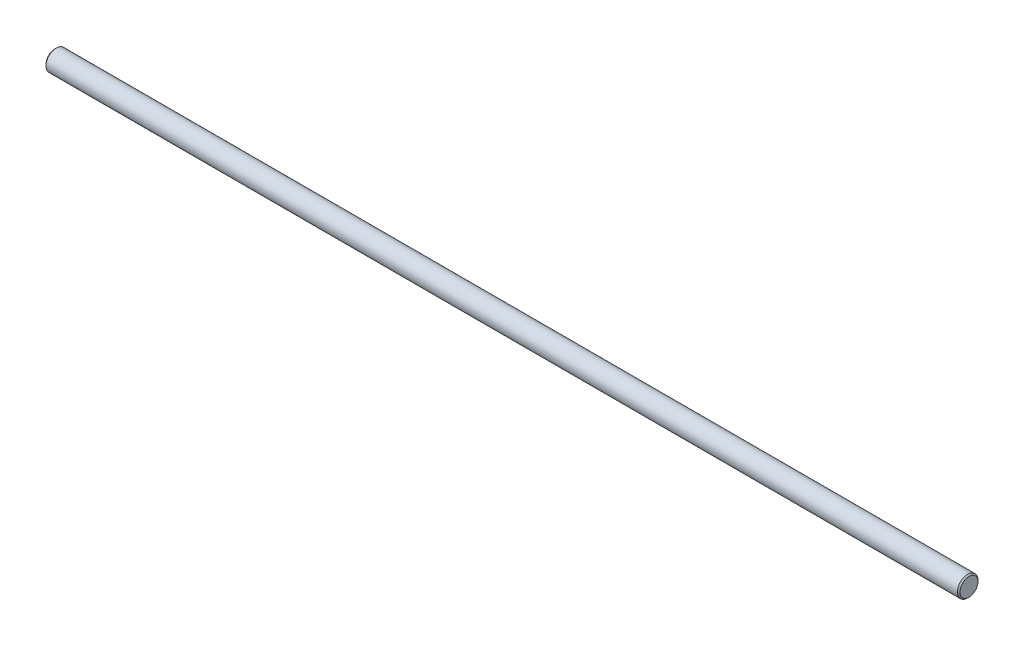
ISO-10303-21;
HEADER;
FILE_DESCRIPTION(('STEP AP214'),'2;1');
FILE_NAME('part.step','',(''),(''),'','','');
FILE_SCHEMA(('AUTOMOTIVE_DESIGN { 1 0 10303 214 1 1 1 1 }'));
ENDSEC;
DATA;
#1=APPLICATION_CONTEXT('core data for automotive mechanical design processes');
#2=APPLICATION_PROTOCOL_DEFINITION('international standard','automotive_design',2000,#1);
#3=PRODUCT_CONTEXT('',#1,'mechanical');
#4=PRODUCT('Part','Part','',(#3));
#5=PRODUCT_RELATED_PRODUCT_CATEGORY('part','',(#4));
#6=PRODUCT_DEFINITION_FORMATION('','',#4);
#7=PRODUCT_DEFINITION_CONTEXT('part definition',#1,'design');
#8=PRODUCT_DEFINITION('design','',#6,#7);
#9=PRODUCT_DEFINITION_SHAPE('','',#8);
#10=(LENGTH_UNIT() NAMED_UNIT(*) SI_UNIT(.MILLI.,.METRE.));
#11=(NAMED_UNIT(*) PLANE_ANGLE_UNIT() SI_UNIT($,.RADIAN.));
#12=(NAMED_UNIT(*) SI_UNIT($,.STERADIAN.) SOLID_ANGLE_UNIT());
#13=UNCERTAINTY_MEASURE_WITH_UNIT(LENGTH_MEASURE(1.E-05),#10,'distance_accuracy_value','');
#14=(GEOMETRIC_REPRESENTATION_CONTEXT(3) GLOBAL_UNCERTAINTY_ASSIGNED_CONTEXT((#13)) GLOBAL_UNIT_ASSIGNED_CONTEXT((#10,
#11,#12)) REPRESENTATION_CONTEXT('',''));
#15=CARTESIAN_POINT('',(0.,0.,0.));
#16=DIRECTION('',(0.,0.,1.));
#17=DIRECTION('',(1.,0.,0.));
#18=AXIS2_PLACEMENT_3D('',#15,#16,#17);
#19=CARTESIAN_POINT('',(0.50000000001296,0.,0.));
#20=DIRECTION('',(1.,0.,0.));
#21=DIRECTION('',(0.,0.,-1.));
#22=AXIS2_PLACEMENT_3D('',#19,#20,#21);
#23=CONICAL_SURFACE('',#22,3.99999999998704,0.785398163397449);
#24=CARTESIAN_POINT('',(0.,0.,0.));
#25=DIRECTION('',(1.,0.,0.));
#26=DIRECTION('',(0.,0.,-1.));
#27=AXIS2_PLACEMENT_3D('',#24,#25,#26);
#28=CIRCLE('',#27,3.49999999997408);
#29=CARTESIAN_POINT('',(0.,0.,-3.49999999997408));
#30=VERTEX_POINT('',#29);
#31=EDGE_CURVE('E47',#30,#30,#28,.T.);
#32=ORIENTED_EDGE('',*,*,#31,.T.);
#33=EDGE_LOOP('',(#32));
#34=FACE_BOUND('',#33,.T.);
#35=CARTESIAN_POINT('',(0.50000000001296,0.,0.));
#36=DIRECTION('',(1.,0.,0.));
#37=DIRECTION('',(0.,0.,-1.));
#38=AXIS2_PLACEMENT_3D('',#35,#36,#37);
#39=CIRCLE('',#38,3.99999999998704);
#40=CARTESIAN_POINT('',(0.50000000001296,0.,-3.99999999998704));
#41=VERTEX_POINT('',#40);
#42=EDGE_CURVE('E10',#41,#41,#39,.T.);
#43=ORIENTED_EDGE('',*,*,#42,.F.);
#44=EDGE_LOOP('',(#43));
#45=FACE_BOUND('',#44,.T.);
#46=ADVANCED_FACE('F33',(#34,#45),#23,.T.);
#47=CARTESIAN_POINT('',(0.,0.,0.));
#48=DIRECTION('',(1.,0.,0.));
#49=DIRECTION('',(0.,0.,-1.));
#50=AXIS2_PLACEMENT_3D('',#47,#48,#49);
#51=CYLINDRICAL_SURFACE('',#50,3.99999999998706);
#52=ORIENTED_EDGE('',*,*,#42,.T.);
#53=EDGE_LOOP('',(#52));
#54=FACE_BOUND('',#53,.T.);
#55=CARTESIAN_POINT('',(354.500000000013,0.,0.));
#56=DIRECTION('',(1.,0.,0.));
#57=DIRECTION('',(0.,0.,-1.));
#58=AXIS2_PLACEMENT_3D('',#55,#56,#57);
#59=CIRCLE('',#58,3.99999999998708);
#60=CARTESIAN_POINT('',(354.500000000013,0.,-3.99999999998708));
#61=VERTEX_POINT('',#60);
#62=EDGE_CURVE('E39',#61,#61,#59,.T.);
#63=ORIENTED_EDGE('',*,*,#62,.F.);
#64=EDGE_LOOP('',(#63));
#65=FACE_BOUND('',#64,.T.);
#66=ADVANCED_FACE('F66',(#54,#65),#51,.T.);
#67=CARTESIAN_POINT('',(354.999999999978,0.,0.));
#68=DIRECTION('',(-1.,0.,0.));
#69=DIRECTION('',(0.,0.,1.));
#70=AXIS2_PLACEMENT_3D('',#67,#68,#69);
#71=CONICAL_SURFACE('',#70,3.50000000002188,0.785398163397406);
#72=ORIENTED_EDGE('',*,*,#62,.T.);
#73=EDGE_LOOP('',(#72));
#74=FACE_BOUND('',#73,.T.);
#75=CARTESIAN_POINT('',(354.999999999978,0.,0.));
#76=DIRECTION('',(1.,0.,0.));
#77=DIRECTION('',(0.,0.,-1.));
#78=AXIS2_PLACEMENT_3D('',#75,#76,#77);
#79=CIRCLE('',#78,3.50000000002188);
#80=CARTESIAN_POINT('',(354.999999999978,0.,-3.50000000002188));
#81=VERTEX_POINT('',#80);
#82=EDGE_CURVE('E43',#81,#81,#79,.T.);
#83=ORIENTED_EDGE('',*,*,#82,.F.);
#84=EDGE_LOOP('',(#83));
#85=FACE_BOUND('',#84,.T.);
#86=ADVANCED_FACE('F62',(#74,#85),#71,.T.);
#87=CARTESIAN_POINT('',(354.999999999978,0.,0.));
#88=DIRECTION('',(1.,0.,0.));
#89=DIRECTION('',(0.,0.,-1.));
#90=AXIS2_PLACEMENT_3D('',#87,#88,#89);
#91=PLANE('',#90);
#92=ORIENTED_EDGE('',*,*,#82,.T.);
#93=EDGE_LOOP('',(#92));
#94=FACE_BOUND('',#93,.T.);
#95=ADVANCED_FACE('F57',(#94),#91,.T.);
#96=CARTESIAN_POINT('',(0.,3.49999999997408,0.));
#97=DIRECTION('',(-1.,0.,0.));
#98=DIRECTION('',(0.,0.,1.));
#99=AXIS2_PLACEMENT_3D('',#96,#97,#98);
#100=PLANE('',#99);
#101=ORIENTED_EDGE('',*,*,#31,.F.);
#102=EDGE_LOOP('',(#101));
#103=FACE_BOUND('',#102,.T.);
#104=ADVANCED_FACE('F55',(#103),#100,.T.);
#105=CLOSED_SHELL('',(#46,#66,#86,#95,#104));
#106=MANIFOLD_SOLID_BREP('B2',#105);
#107=ADVANCED_BREP_SHAPE_REPRESENTATION('',(#18,#106),#14);
#108=SHAPE_DEFINITION_REPRESENTATION(#9,#107);
ENDSEC;
END-ISO-10303-21;
